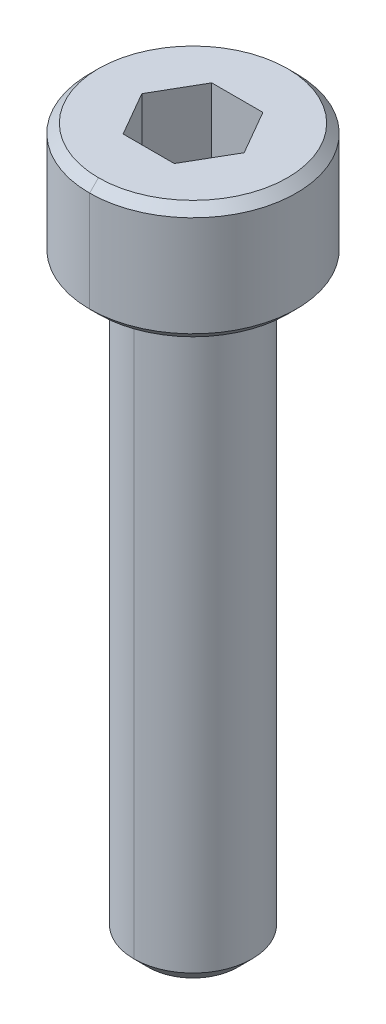
ISO-10303-21;
HEADER;
FILE_DESCRIPTION(('STEP AP214'),'2;1');
FILE_NAME('part.step','',(''),(''),'','','');
FILE_SCHEMA(('AUTOMOTIVE_DESIGN { 1 0 10303 214 1 1 1 1 }'));
ENDSEC;
DATA;
#1=APPLICATION_CONTEXT('core data for automotive mechanical design processes');
#2=APPLICATION_PROTOCOL_DEFINITION('international standard','automotive_design',2000,#1);
#3=PRODUCT_CONTEXT('',#1,'mechanical');
#4=PRODUCT('Part','Part','',(#3));
#5=PRODUCT_RELATED_PRODUCT_CATEGORY('part','',(#4));
#6=PRODUCT_DEFINITION_FORMATION('','',#4);
#7=PRODUCT_DEFINITION_CONTEXT('part definition',#1,'design');
#8=PRODUCT_DEFINITION('design','',#6,#7);
#9=PRODUCT_DEFINITION_SHAPE('','',#8);
#10=(LENGTH_UNIT() NAMED_UNIT(*) SI_UNIT(.MILLI.,.METRE.));
#11=(NAMED_UNIT(*) PLANE_ANGLE_UNIT() SI_UNIT($,.RADIAN.));
#12=(NAMED_UNIT(*) SI_UNIT($,.STERADIAN.) SOLID_ANGLE_UNIT());
#13=UNCERTAINTY_MEASURE_WITH_UNIT(LENGTH_MEASURE(1.E-05),#10,'distance_accuracy_value','');
#14=(GEOMETRIC_REPRESENTATION_CONTEXT(3) GLOBAL_UNCERTAINTY_ASSIGNED_CONTEXT((#13)) GLOBAL_UNIT_ASSIGNED_CONTEXT((#10,
#11,#12)) REPRESENTATION_CONTEXT('',''));
#15=CARTESIAN_POINT('',(0.,0.,0.));
#16=DIRECTION('',(0.,0.,1.));
#17=DIRECTION('',(1.,0.,0.));
#18=AXIS2_PLACEMENT_3D('',#15,#16,#17);
#19=CARTESIAN_POINT('',(0.866025403784439,21.,1.5));
#20=DIRECTION('',(0.866025403784439,0.,0.5));
#21=DIRECTION('',(0.5,0.,-0.866025403784439));
#22=AXIS2_PLACEMENT_3D('',#19,#20,#21);
#23=PLANE('',#22);
#24=DIRECTION('',(0.5,0.,-0.866025403784439));
#25=VECTOR('',#24,1.);
#26=CARTESIAN_POINT('',(0.866025403784439,21.,1.5));
#27=LINE('',#26,#25);
#28=CARTESIAN_POINT('',(0.866025403784439,21.,1.5));
#29=VERTEX_POINT('',#28);
#30=CARTESIAN_POINT('',(1.73205080756888,21.,0.));
#31=VERTEX_POINT('',#30);
#32=EDGE_CURVE('E179',#29,#31,#27,.T.);
#33=ORIENTED_EDGE('',*,*,#32,.F.);
#34=DIRECTION('',(0.,1.,0.));
#35=VECTOR('',#34,1.);
#36=CARTESIAN_POINT('',(0.866025403784439,21.,1.5));
#37=LINE('',#36,#35);
#38=CARTESIAN_POINT('',(0.866025403784439,24.,1.5));
#39=VERTEX_POINT('',#38);
#40=EDGE_CURVE('E167',#29,#39,#37,.T.);
#41=ORIENTED_EDGE('',*,*,#40,.T.);
#42=DIRECTION('',(0.5,0.,-0.866025403784439));
#43=VECTOR('',#42,1.);
#44=CARTESIAN_POINT('',(0.866025403784439,24.,1.5));
#45=LINE('',#44,#43);
#46=CARTESIAN_POINT('',(1.73205080756888,24.,0.));
#47=VERTEX_POINT('',#46);
#48=EDGE_CURVE('E181',#47,#39,#45,.F.);
#49=ORIENTED_EDGE('',*,*,#48,.F.);
#50=DIRECTION('',(0.,1.,0.));
#51=VECTOR('',#50,1.);
#52=CARTESIAN_POINT('',(1.73205080756888,21.,0.));
#53=LINE('',#52,#51);
#54=EDGE_CURVE('E174',#47,#31,#53,.F.);
#55=ORIENTED_EDGE('',*,*,#54,.T.);
#56=EDGE_LOOP('',(#33,#41,#49,#55));
#57=FACE_BOUND('',#56,.T.);
#58=ADVANCED_FACE('F17',(#57),#23,.F.);
#59=CARTESIAN_POINT('',(1.73205080756888,21.,0.));
#60=DIRECTION('',(0.866025403784438,0.,-0.5));
#61=DIRECTION('',(-0.5,0.,-0.866025403784438));
#62=AXIS2_PLACEMENT_3D('',#59,#60,#61);
#63=PLANE('',#62);
#64=DIRECTION('',(-0.5,0.,-0.866025403784438));
#65=VECTOR('',#64,1.);
#66=CARTESIAN_POINT('',(1.73205080756888,21.,0.));
#67=LINE('',#66,#65);
#68=CARTESIAN_POINT('',(0.866025403784438,21.,-1.5));
#69=VERTEX_POINT('',#68);
#70=EDGE_CURVE('E172',#31,#69,#67,.T.);
#71=ORIENTED_EDGE('',*,*,#70,.F.);
#72=ORIENTED_EDGE('',*,*,#54,.F.);
#73=DIRECTION('',(-0.5,0.,-0.866025403784438));
#74=VECTOR('',#73,1.);
#75=CARTESIAN_POINT('',(1.73205080756888,24.,0.));
#76=LINE('',#75,#74);
#77=CARTESIAN_POINT('',(0.866025403784439,24.,-1.5));
#78=VERTEX_POINT('',#77);
#79=EDGE_CURVE('E177',#78,#47,#76,.F.);
#80=ORIENTED_EDGE('',*,*,#79,.F.);
#81=DIRECTION('',(0.,1.,0.));
#82=VECTOR('',#81,1.);
#83=CARTESIAN_POINT('',(0.866025403784438,21.,-1.5));
#84=LINE('',#83,#82);
#85=EDGE_CURVE('E162',#78,#69,#84,.F.);
#86=ORIENTED_EDGE('',*,*,#85,.T.);
#87=EDGE_LOOP('',(#71,#72,#80,#86));
#88=FACE_BOUND('',#87,.T.);
#89=ADVANCED_FACE('F417',(#88),#63,.F.);
#90=CARTESIAN_POINT('',(-0.866025403784438,21.,1.5));
#91=DIRECTION('',(0.,0.,1.));
#92=DIRECTION('',(1.,0.,0.));
#93=AXIS2_PLACEMENT_3D('',#90,#91,#92);
#94=PLANE('',#93);
#95=DIRECTION('',(1.,0.,0.));
#96=VECTOR('',#95,1.);
#97=CARTESIAN_POINT('',(1.73205080756888,21.,1.5));
#98=LINE('',#97,#96);
#99=CARTESIAN_POINT('',(-0.866025403784438,21.,1.5));
#100=VERTEX_POINT('',#99);
#101=EDGE_CURVE('E159',#100,#29,#98,.T.);
#102=ORIENTED_EDGE('',*,*,#101,.F.);
#103=DIRECTION('',(0.,1.,0.));
#104=VECTOR('',#103,1.);
#105=CARTESIAN_POINT('',(-0.866025403784438,21.,1.5));
#106=LINE('',#105,#104);
#107=CARTESIAN_POINT('',(-0.866025403784438,24.,1.5));
#108=VERTEX_POINT('',#107);
#109=EDGE_CURVE('E148',#100,#108,#106,.T.);
#110=ORIENTED_EDGE('',*,*,#109,.T.);
#111=DIRECTION('',(1.,0.,0.));
#112=VECTOR('',#111,1.);
#113=CARTESIAN_POINT('',(-0.866025403784438,24.,1.5));
#114=LINE('',#113,#112);
#115=EDGE_CURVE('E170',#39,#108,#114,.F.);
#116=ORIENTED_EDGE('',*,*,#115,.F.);
#117=ORIENTED_EDGE('',*,*,#40,.F.);
#118=EDGE_LOOP('',(#102,#110,#116,#117));
#119=FACE_BOUND('',#118,.T.);
#120=ADVANCED_FACE('F408',(#119),#94,.F.);
#121=CARTESIAN_POINT('',(0.866025403784438,21.,-1.5));
#122=DIRECTION('',(0.,0.,-1.));
#123=DIRECTION('',(-1.,0.,0.));
#124=AXIS2_PLACEMENT_3D('',#121,#122,#123);
#125=PLANE('',#124);
#126=DIRECTION('',(1.,0.,0.));
#127=VECTOR('',#126,1.);
#128=CARTESIAN_POINT('',(1.73205080756888,21.,-1.5));
#129=LINE('',#128,#127);
#130=CARTESIAN_POINT('',(-0.866025403784438,21.,-1.5));
#131=VERTEX_POINT('',#130);
#132=EDGE_CURVE('E156',#69,#131,#129,.F.);
#133=ORIENTED_EDGE('',*,*,#132,.F.);
#134=ORIENTED_EDGE('',*,*,#85,.F.);
#135=DIRECTION('',(-1.,0.,0.));
#136=VECTOR('',#135,1.);
#137=CARTESIAN_POINT('',(0.866025403784438,24.,-1.5));
#138=LINE('',#137,#136);
#139=CARTESIAN_POINT('',(-0.866025403784438,24.,-1.5));
#140=VERTEX_POINT('',#139);
#141=EDGE_CURVE('E165',#140,#78,#138,.F.);
#142=ORIENTED_EDGE('',*,*,#141,.F.);
#143=DIRECTION('',(0.,1.,0.));
#144=VECTOR('',#143,1.);
#145=CARTESIAN_POINT('',(-0.866025403784438,21.,-1.5));
#146=LINE('',#145,#144);
#147=EDGE_CURVE('E146',#140,#131,#146,.F.);
#148=ORIENTED_EDGE('',*,*,#147,.T.);
#149=EDGE_LOOP('',(#133,#134,#142,#148));
#150=FACE_BOUND('',#149,.T.);
#151=ADVANCED_FACE('F399',(#150),#125,.F.);
#152=CARTESIAN_POINT('',(1.73205080756888,21.,0.));
#153=DIRECTION('',(0.,1.,0.));
#154=DIRECTION('',(0.,0.,1.));
#155=AXIS2_PLACEMENT_3D('',#152,#153,#154);
#156=PLANE('',#155);
#157=ORIENTED_EDGE('',*,*,#132,.T.);
#158=DIRECTION('',(-0.5,0.,0.866025403784439));
#159=VECTOR('',#158,1.);
#160=CARTESIAN_POINT('',(-0.866025403784438,21.,-1.5));
#161=LINE('',#160,#159);
#162=CARTESIAN_POINT('',(-1.73205080756888,21.,0.));
#163=VERTEX_POINT('',#162);
#164=EDGE_CURVE('E144',#131,#163,#161,.T.);
#165=ORIENTED_EDGE('',*,*,#164,.T.);
#166=DIRECTION('',(0.5,0.,0.866025403784439));
#167=VECTOR('',#166,1.);
#168=CARTESIAN_POINT('',(-1.73205080756888,21.,0.));
#169=LINE('',#168,#167);
#170=EDGE_CURVE('E151',#163,#100,#169,.T.);
#171=ORIENTED_EDGE('',*,*,#170,.T.);
#172=ORIENTED_EDGE('',*,*,#101,.T.);
#173=ORIENTED_EDGE('',*,*,#32,.T.);
#174=ORIENTED_EDGE('',*,*,#70,.T.);
#175=EDGE_LOOP('',(#157,#165,#171,#172,#173,#174));
#176=FACE_BOUND('',#175,.T.);
#177=ADVANCED_FACE('F390',(#176),#156,.T.);
#178=CARTESIAN_POINT('',(-1.73205080756888,21.,0.));
#179=DIRECTION('',(-0.866025403784439,0.,0.5));
#180=DIRECTION('',(0.5,0.,0.866025403784439));
#181=AXIS2_PLACEMENT_3D('',#178,#179,#180);
#182=PLANE('',#181);
#183=ORIENTED_EDGE('',*,*,#170,.F.);
#184=DIRECTION('',(0.,1.,0.));
#185=VECTOR('',#184,1.);
#186=CARTESIAN_POINT('',(-1.73205080756888,21.,0.));
#187=LINE('',#186,#185);
#188=CARTESIAN_POINT('',(-1.73205080756888,24.,0.));
#189=VERTEX_POINT('',#188);
#190=EDGE_CURVE('E141',#163,#189,#187,.T.);
#191=ORIENTED_EDGE('',*,*,#190,.T.);
#192=DIRECTION('',(0.5,0.,0.866025403784439));
#193=VECTOR('',#192,1.);
#194=CARTESIAN_POINT('',(-1.73205080756888,24.,0.));
#195=LINE('',#194,#193);
#196=EDGE_CURVE('E154',#108,#189,#195,.F.);
#197=ORIENTED_EDGE('',*,*,#196,.F.);
#198=ORIENTED_EDGE('',*,*,#109,.F.);
#199=EDGE_LOOP('',(#183,#191,#197,#198));
#200=FACE_BOUND('',#199,.T.);
#201=ADVANCED_FACE('F381',(#200),#182,.F.);
#202=CARTESIAN_POINT('',(-0.866025403784438,21.,-1.5));
#203=DIRECTION('',(-0.866025403784439,0.,-0.5));
#204=DIRECTION('',(-0.5,0.,0.866025403784439));
#205=AXIS2_PLACEMENT_3D('',#202,#203,#204);
#206=PLANE('',#205);
#207=ORIENTED_EDGE('',*,*,#164,.F.);
#208=ORIENTED_EDGE('',*,*,#147,.F.);
#209=DIRECTION('',(0.5,0.,-0.866025403784439));
#210=VECTOR('',#209,1.);
#211=CARTESIAN_POINT('',(-1.73205080756888,24.,0.));
#212=LINE('',#211,#210);
#213=EDGE_CURVE('E122',#189,#140,#212,.T.);
#214=ORIENTED_EDGE('',*,*,#213,.F.);
#215=ORIENTED_EDGE('',*,*,#190,.F.);
#216=EDGE_LOOP('',(#207,#208,#214,#215));
#217=FACE_BOUND('',#216,.T.);
#218=ADVANCED_FACE('F373',(#217),#206,.F.);
#219=CARTESIAN_POINT('',(0.,24.,-3.5));
#220=DIRECTION('',(0.,1.,0.));
#221=DIRECTION('',(0.,0.,1.));
#222=AXIS2_PLACEMENT_3D('',#219,#220,#221);
#223=PLANE('',#222);
#224=CARTESIAN_POINT('',(0.,24.0000000000009,0.));
#225=DIRECTION('',(0.,-1.,0.));
#226=DIRECTION('',(1.,0.,0.));
#227=AXIS2_PLACEMENT_3D('',#224,#225,#226);
#228=CIRCLE('',#227,3.19999999999254);
#229=CARTESIAN_POINT('',(0.,24.0000000000009,-3.19999999999254));
#230=VERTEX_POINT('',#229);
#231=CARTESIAN_POINT('',(0.,24.0000000000009,3.19999999999254));
#232=VERTEX_POINT('',#231);
#233=EDGE_CURVE('E111',#230,#232,#228,.T.);
#234=ORIENTED_EDGE('',*,*,#233,.F.);
#235=CARTESIAN_POINT('',(0.,24.0000000000009,0.));
#236=DIRECTION('',(0.,-1.,0.));
#237=DIRECTION('',(1.,0.,0.));
#238=AXIS2_PLACEMENT_3D('',#235,#236,#237);
#239=CIRCLE('',#238,3.19999999999254);
#240=EDGE_CURVE('E20',#232,#230,#239,.T.);
#241=ORIENTED_EDGE('',*,*,#240,.F.);
#242=EDGE_LOOP('',(#234,#241));
#243=FACE_BOUND('',#242,.T.);
#244=ORIENTED_EDGE('',*,*,#196,.T.);
#245=ORIENTED_EDGE('',*,*,#213,.T.);
#246=ORIENTED_EDGE('',*,*,#141,.T.);
#247=ORIENTED_EDGE('',*,*,#79,.T.);
#248=ORIENTED_EDGE('',*,*,#48,.T.);
#249=ORIENTED_EDGE('',*,*,#115,.T.);
#250=EDGE_LOOP('',(#244,#245,#246,#247,#248,#249));
#251=FACE_BOUND('',#250,.T.);
#252=ADVANCED_FACE('F112',(#243,#251),#223,.T.);
#253=CARTESIAN_POINT('',(0.,23.6999999999057,0.));
#254=DIRECTION('',(0.,-1.,0.));
#255=DIRECTION('',(1.,0.,0.));
#256=AXIS2_PLACEMENT_3D('',#253,#254,#255);
#257=CONICAL_SURFACE('',#256,3.49999999997408,0.78539816320797);
#258=DIRECTION('',(0.,0.707106781253538,0.707106781119557));
#259=VECTOR('',#258,1.);
#260=CARTESIAN_POINT('',(0.,-498972.800094549,-499000.));
#261=LINE('',#260,#259);
#262=CARTESIAN_POINT('',(0.,23.6999999999764,-3.49999999999352));
#263=VERTEX_POINT('',#262);
#264=EDGE_CURVE('E120',#263,#230,#261,.T.);
#265=ORIENTED_EDGE('',*,*,#264,.F.);
#266=CARTESIAN_POINT('',(0.,23.7,0.));
#267=DIRECTION('',(0.,-1.,0.));
#268=DIRECTION('',(0.,0.,-1.));
#269=AXIS2_PLACEMENT_3D('',#266,#267,#268);
#270=CIRCLE('',#269,3.5);
#271=CARTESIAN_POINT('',(0.,23.6999999999764,3.49999999999352));
#272=VERTEX_POINT('',#271);
#273=EDGE_CURVE('E127',#272,#263,#270,.T.);
#274=ORIENTED_EDGE('',*,*,#273,.F.);
#275=DIRECTION('',(0.,0.707106781253538,-0.707106781119557));
#276=VECTOR('',#275,1.);
#277=CARTESIAN_POINT('',(6.11098752774529E-11,-498972.800094549,499000.));
#278=LINE('',#277,#276);
#279=EDGE_CURVE('E117',#232,#272,#278,.F.);
#280=ORIENTED_EDGE('',*,*,#279,.F.);
#281=ORIENTED_EDGE('',*,*,#240,.T.);
#282=EDGE_LOOP('',(#265,#274,#280,#281));
#283=FACE_BOUND('',#282,.T.);
#284=ADVANCED_FACE('F119',(#283),#257,.T.);
#285=CARTESIAN_POINT('',(0.,23.6999999999057,0.));
#286=DIRECTION('',(0.,-1.,0.));
#287=DIRECTION('',(1.,0.,0.));
#288=AXIS2_PLACEMENT_3D('',#285,#286,#287);
#289=CONICAL_SURFACE('',#288,3.49999999997408,0.78539816320797);
#290=CARTESIAN_POINT('',(0.,23.7,0.));
#291=DIRECTION('',(0.,-1.,0.));
#292=DIRECTION('',(0.,0.,-1.));
#293=AXIS2_PLACEMENT_3D('',#290,#291,#292);
#294=CIRCLE('',#293,3.5);
#295=EDGE_CURVE('E125',#263,#272,#294,.T.);
#296=ORIENTED_EDGE('',*,*,#295,.F.);
#297=ORIENTED_EDGE('',*,*,#264,.T.);
#298=ORIENTED_EDGE('',*,*,#233,.T.);
#299=ORIENTED_EDGE('',*,*,#279,.T.);
#300=EDGE_LOOP('',(#296,#297,#298,#299));
#301=FACE_BOUND('',#300,.T.);
#302=ADVANCED_FACE('F123',(#301),#289,.T.);
#303=CARTESIAN_POINT('',(0.,0.,0.));
#304=DIRECTION('',(0.,-1.,0.));
#305=DIRECTION('',(0.,0.,-1.));
#306=AXIS2_PLACEMENT_3D('',#303,#304,#305);
#307=CYLINDRICAL_SURFACE('',#306,3.5);
#308=DIRECTION('',(0.,-1.,0.));
#309=VECTOR('',#308,1.);
#310=CARTESIAN_POINT('',(0.,0.,-3.5));
#311=LINE('',#310,#309);
#312=CARTESIAN_POINT('',(0.,20.2999999999776,-3.49999999999477));
#313=VERTEX_POINT('',#312);
#314=EDGE_CURVE('E226',#313,#263,#311,.F.);
#315=ORIENTED_EDGE('',*,*,#314,.F.);
#316=CARTESIAN_POINT('',(0.,20.3000000000202,0.));
#317=DIRECTION('',(0.,1.,0.));
#318=DIRECTION('',(0.,0.,1.));
#319=AXIS2_PLACEMENT_3D('',#316,#317,#318);
#320=CIRCLE('',#319,3.50000000003092);
#321=CARTESIAN_POINT('',(0.,20.2999999999918,3.49999999999477));
#322=VERTEX_POINT('',#321);
#323=EDGE_CURVE('E221',#322,#313,#320,.F.);
#324=ORIENTED_EDGE('',*,*,#323,.F.);
#325=DIRECTION('',(0.,-1.,0.));
#326=VECTOR('',#325,1.);
#327=CARTESIAN_POINT('',(0.,0.,3.5));
#328=LINE('',#327,#326);
#329=EDGE_CURVE('E231',#272,#322,#328,.T.);
#330=ORIENTED_EDGE('',*,*,#329,.F.);
#331=ORIENTED_EDGE('',*,*,#273,.T.);
#332=EDGE_LOOP('',(#315,#324,#330,#331));
#333=FACE_BOUND('',#332,.T.);
#334=ADVANCED_FACE('F246',(#333),#307,.T.);
#335=CARTESIAN_POINT('',(0.,0.,0.));
#336=DIRECTION('',(0.,-1.,0.));
#337=DIRECTION('',(0.,0.,-1.));
#338=AXIS2_PLACEMENT_3D('',#335,#336,#337);
#339=CYLINDRICAL_SURFACE('',#338,3.5);
#340=CARTESIAN_POINT('',(0.,20.3000000000202,0.));
#341=DIRECTION('',(0.,1.,0.));
#342=DIRECTION('',(0.,0.,1.));
#343=AXIS2_PLACEMENT_3D('',#340,#341,#342);
#344=CIRCLE('',#343,3.50000000003092);
#345=EDGE_CURVE('E206',#313,#322,#344,.F.);
#346=ORIENTED_EDGE('',*,*,#345,.F.);
#347=ORIENTED_EDGE('',*,*,#314,.T.);
#348=ORIENTED_EDGE('',*,*,#295,.T.);
#349=ORIENTED_EDGE('',*,*,#329,.T.);
#350=EDGE_LOOP('',(#346,#347,#348,#349));
#351=FACE_BOUND('',#350,.T.);
#352=ADVANCED_FACE('F243',(#351),#339,.T.);
#353=CARTESIAN_POINT('',(0.,20.2999999999065,0.));
#354=DIRECTION('',(0.,1.,0.));
#355=DIRECTION('',(0.,0.,1.));
#356=AXIS2_PLACEMENT_3D('',#353,#354,#355);
#357=CONICAL_SURFACE('',#356,3.49999999991724,0.785398163397448);
#358=DIRECTION('',(0.,-0.707106781186548,-0.707106781186548));
#359=VECTOR('',#358,1.);
#360=CARTESIAN_POINT('',(0.,499000.,498983.2));
#361=LINE('',#360,#359);
#362=CARTESIAN_POINT('',(0.,19.999999999925,3.1999999999357));
#363=VERTEX_POINT('',#362);
#364=EDGE_CURVE('E203',#322,#363,#361,.T.);
#365=ORIENTED_EDGE('',*,*,#364,.F.);
#366=ORIENTED_EDGE('',*,*,#323,.T.);
#367=DIRECTION('',(0.,-0.707106781186548,0.707106781186548));
#368=VECTOR('',#367,1.);
#369=CARTESIAN_POINT('',(6.11078178708304E-11,499000.,-498983.2));
#370=LINE('',#369,#368);
#371=CARTESIAN_POINT('',(0.,19.999999999925,-3.1999999999357));
#372=VERTEX_POINT('',#371);
#373=EDGE_CURVE('E212',#372,#313,#370,.F.);
#374=ORIENTED_EDGE('',*,*,#373,.F.);
#375=CARTESIAN_POINT('',(0.,19.999999999925,0.));
#376=DIRECTION('',(0.,1.,0.));
#377=DIRECTION('',(0.,0.,1.));
#378=AXIS2_PLACEMENT_3D('',#375,#376,#377);
#379=CIRCLE('',#378,3.1999999999357);
#380=EDGE_CURVE('E198',#363,#372,#379,.F.);
#381=ORIENTED_EDGE('',*,*,#380,.F.);
#382=EDGE_LOOP('',(#365,#366,#374,#381));
#383=FACE_BOUND('',#382,.T.);
#384=ADVANCED_FACE('F248',(#383),#357,.T.);
#385=CARTESIAN_POINT('',(0.,20.2999999999065,0.));
#386=DIRECTION('',(0.,1.,0.));
#387=DIRECTION('',(0.,0.,1.));
#388=AXIS2_PLACEMENT_3D('',#385,#386,#387);
#389=CONICAL_SURFACE('',#388,3.49999999991724,0.785398163397448);
#390=ORIENTED_EDGE('',*,*,#345,.T.);
#391=ORIENTED_EDGE('',*,*,#364,.T.);
#392=CARTESIAN_POINT('',(0.,19.999999999925,0.));
#393=DIRECTION('',(0.,1.,0.));
#394=DIRECTION('',(0.,0.,1.));
#395=AXIS2_PLACEMENT_3D('',#392,#393,#394);
#396=CIRCLE('',#395,3.1999999999357);
#397=EDGE_CURVE('E195',#372,#363,#396,.F.);
#398=ORIENTED_EDGE('',*,*,#397,.F.);
#399=ORIENTED_EDGE('',*,*,#373,.T.);
#400=EDGE_LOOP('',(#390,#391,#398,#399));
#401=FACE_BOUND('',#400,.T.);
#402=ADVANCED_FACE('F249',(#401),#389,.T.);
#403=CARTESIAN_POINT('',(0.,0.,0.));
#404=DIRECTION('',(0.,-1.,0.));
#405=DIRECTION('',(0.,0.,-1.));
#406=AXIS2_PLACEMENT_3D('',#403,#404,#405);
#407=PLANE('',#406);
#408=CARTESIAN_POINT('',(0.,1.13686837721616E-10,0.));
#409=DIRECTION('',(0.,1.,0.));
#410=DIRECTION('',(0.,0.,1.));
#411=AXIS2_PLACEMENT_3D('',#408,#409,#410);
#412=CIRCLE('',#411,1.50000000002137);
#413=CARTESIAN_POINT('',(0.,1.13686837721616E-10,1.50000000002137));
#414=VERTEX_POINT('',#413);
#415=CARTESIAN_POINT('',(0.,1.13686837721616E-10,-1.50000000002137));
#416=VERTEX_POINT('',#415);
#417=EDGE_CURVE('E191',#414,#416,#412,.T.);
#418=ORIENTED_EDGE('',*,*,#417,.F.);
#419=CARTESIAN_POINT('',(0.,1.13686837721616E-10,0.));
#420=DIRECTION('',(0.,1.,0.));
#421=DIRECTION('',(0.,0.,1.));
#422=AXIS2_PLACEMENT_3D('',#419,#420,#421);
#423=CIRCLE('',#422,1.50000000002137);
#424=EDGE_CURVE('E201',#416,#414,#423,.T.);
#425=ORIENTED_EDGE('',*,*,#424,.F.);
#426=EDGE_LOOP('',(#418,#425));
#427=FACE_BOUND('',#426,.T.);
#428=ADVANCED_FACE('F271',(#427),#407,.T.);
#429=CARTESIAN_POINT('',(0.,0.50000000004502,0.));
#430=DIRECTION('',(0.,1.,0.));
#431=DIRECTION('',(0.,0.,1.));
#432=AXIS2_PLACEMENT_3D('',#429,#430,#431);
#433=CONICAL_SURFACE('',#432,1.99999999995271,0.785398163397448);
#434=DIRECTION('',(0.,-0.707106781186548,-0.707106781186547));
#435=VECTOR('',#434,1.);
#436=CARTESIAN_POINT('',(0.,498998.5,499000.));
#437=LINE('',#436,#435);
#438=CARTESIAN_POINT('',(0.,0.500000000028138,1.99999999997044));
#439=VERTEX_POINT('',#438);
#440=EDGE_CURVE('E190',#439,#414,#437,.T.);
#441=ORIENTED_EDGE('',*,*,#440,.F.);
#442=CARTESIAN_POINT('',(0.,0.500000000000003,0.));
#443=DIRECTION('',(0.,-1.,0.));
#444=DIRECTION('',(0.,0.,-1.));
#445=AXIS2_PLACEMENT_3D('',#442,#443,#444);
#446=CIRCLE('',#445,2.);
#447=CARTESIAN_POINT('',(0.,0.500000000033766,-1.99999999996453));
#448=VERTEX_POINT('',#447);
#449=EDGE_CURVE('E35',#448,#439,#446,.F.);
#450=ORIENTED_EDGE('',*,*,#449,.F.);
#451=DIRECTION('',(0.,-0.707106781186548,0.707106781186547));
#452=VECTOR('',#451,1.);
#453=CARTESIAN_POINT('',(6.11098752774529E-11,498998.5,-499000.));
#454=LINE('',#453,#452);
#455=EDGE_CURVE('E194',#416,#448,#454,.F.);
#456=ORIENTED_EDGE('',*,*,#455,.F.);
#457=ORIENTED_EDGE('',*,*,#424,.T.);
#458=EDGE_LOOP('',(#441,#450,#456,#457));
#459=FACE_BOUND('',#458,.T.);
#460=ADVANCED_FACE('F255',(#459),#433,.T.);
#461=CARTESIAN_POINT('',(0.,20.,-2.));
#462=DIRECTION('',(0.,-1.,0.));
#463=DIRECTION('',(0.,0.,-1.));
#464=AXIS2_PLACEMENT_3D('',#461,#462,#463);
#465=PLANE('',#464);
#466=ORIENTED_EDGE('',*,*,#380,.T.);
#467=ORIENTED_EDGE('',*,*,#397,.T.);
#468=EDGE_LOOP('',(#466,#467));
#469=FACE_BOUND('',#468,.T.);
#470=CARTESIAN_POINT('',(0.,20.,0.));
#471=DIRECTION('',(0.,-1.,0.));
#472=DIRECTION('',(0.,0.,-1.));
#473=AXIS2_PLACEMENT_3D('',#470,#471,#472);
#474=CIRCLE('',#473,2.);
#475=CARTESIAN_POINT('',(0.,20.,-2.));
#476=VERTEX_POINT('',#475);
#477=CARTESIAN_POINT('',(0.,20.,2.));
#478=VERTEX_POINT('',#477);
#479=EDGE_CURVE('E183',#476,#478,#474,.T.);
#480=ORIENTED_EDGE('',*,*,#479,.F.);
#481=CARTESIAN_POINT('',(0.,20.,0.));
#482=DIRECTION('',(0.,-1.,0.));
#483=DIRECTION('',(0.,0.,-1.));
#484=AXIS2_PLACEMENT_3D('',#481,#482,#483);
#485=CIRCLE('',#484,2.);
#486=EDGE_CURVE('E187',#478,#476,#485,.T.);
#487=ORIENTED_EDGE('',*,*,#486,.F.);
#488=EDGE_LOOP('',(#480,#487));
#489=FACE_BOUND('',#488,.T.);
#490=ADVANCED_FACE('F251',(#469,#489),#465,.T.);
#491=CARTESIAN_POINT('',(0.,0.50000000004502,0.));
#492=DIRECTION('',(0.,1.,0.));
#493=DIRECTION('',(0.,0.,1.));
#494=AXIS2_PLACEMENT_3D('',#491,#492,#493);
#495=CONICAL_SURFACE('',#494,1.99999999995271,0.785398163397448);
#496=CARTESIAN_POINT('',(0.,0.500000000000003,0.));
#497=DIRECTION('',(0.,-1.,0.));
#498=DIRECTION('',(0.,0.,-1.));
#499=AXIS2_PLACEMENT_3D('',#496,#497,#498);
#500=CIRCLE('',#499,2.);
#501=EDGE_CURVE('E26',#439,#448,#500,.F.);
#502=ORIENTED_EDGE('',*,*,#501,.F.);
#503=ORIENTED_EDGE('',*,*,#440,.T.);
#504=ORIENTED_EDGE('',*,*,#417,.T.);
#505=ORIENTED_EDGE('',*,*,#455,.T.);
#506=EDGE_LOOP('',(#502,#503,#504,#505));
#507=FACE_BOUND('',#506,.T.);
#508=ADVANCED_FACE('F254',(#507),#495,.T.);
#509=CARTESIAN_POINT('',(0.,0.,0.));
#510=DIRECTION('',(0.,-1.,0.));
#511=DIRECTION('',(0.,0.,-1.));
#512=AXIS2_PLACEMENT_3D('',#509,#510,#511);
#513=CYLINDRICAL_SURFACE('',#512,2.);
#514=DIRECTION('',(0.,-1.,0.));
#515=VECTOR('',#514,1.);
#516=CARTESIAN_POINT('',(0.,0.,-2.));
#517=LINE('',#516,#515);
#518=EDGE_CURVE('E11',#448,#476,#517,.F.);
#519=ORIENTED_EDGE('',*,*,#518,.F.);
#520=ORIENTED_EDGE('',*,*,#449,.T.);
#521=DIRECTION('',(0.,-1.,0.));
#522=VECTOR('',#521,1.);
#523=CARTESIAN_POINT('',(0.,0.,2.));
#524=LINE('',#523,#522);
#525=EDGE_CURVE('E186',#478,#439,#524,.T.);
#526=ORIENTED_EDGE('',*,*,#525,.F.);
#527=ORIENTED_EDGE('',*,*,#486,.T.);
#528=EDGE_LOOP('',(#519,#520,#526,#527));
#529=FACE_BOUND('',#528,.T.);
#530=ADVANCED_FACE('F262',(#529),#513,.T.);
#531=CARTESIAN_POINT('',(0.,0.,0.));
#532=DIRECTION('',(0.,-1.,0.));
#533=DIRECTION('',(0.,0.,-1.));
#534=AXIS2_PLACEMENT_3D('',#531,#532,#533);
#535=CYLINDRICAL_SURFACE('',#534,2.);
#536=ORIENTED_EDGE('',*,*,#501,.T.);
#537=ORIENTED_EDGE('',*,*,#518,.T.);
#538=ORIENTED_EDGE('',*,*,#479,.T.);
#539=ORIENTED_EDGE('',*,*,#525,.T.);
#540=EDGE_LOOP('',(#536,#537,#538,#539));
#541=FACE_BOUND('',#540,.T.);
#542=ADVANCED_FACE('F264',(#541),#535,.T.);
#543=CLOSED_SHELL('',(#58,#89,#120,#151,#177,#201,#218,#252,#284,#302,#334,#352,#384,#402,#428,
#460,#490,#508,#530,#542));
#544=MANIFOLD_SOLID_BREP('B1',#543);
#545=ADVANCED_BREP_SHAPE_REPRESENTATION('',(#18,#544),#14);
#546=SHAPE_DEFINITION_REPRESENTATION(#9,#545);
ENDSEC;
END-ISO-10303-21;
